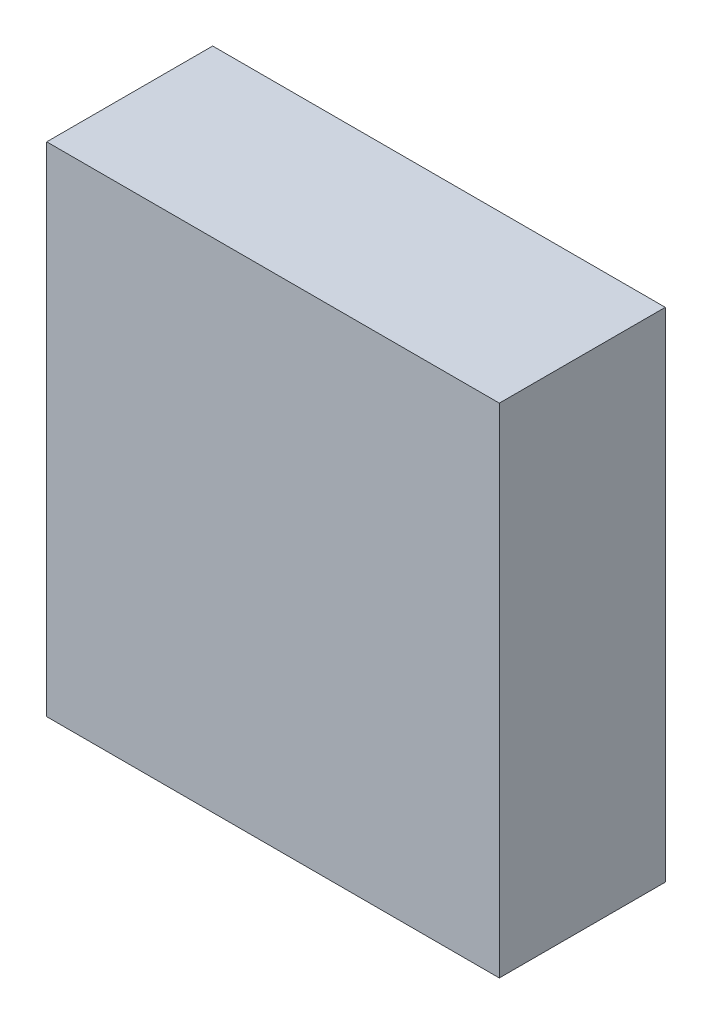
ISO-10303-21;
HEADER;
FILE_DESCRIPTION(('STEP AP214'),'2;1');
FILE_NAME('part.step','',(''),(''),'','','');
FILE_SCHEMA(('AUTOMOTIVE_DESIGN { 1 0 10303 214 1 1 1 1 }'));
ENDSEC;
DATA;
#1=APPLICATION_CONTEXT('core data for automotive mechanical design processes');
#2=APPLICATION_PROTOCOL_DEFINITION('international standard','automotive_design',2000,#1);
#3=PRODUCT_CONTEXT('',#1,'mechanical');
#4=PRODUCT('Part','Part','',(#3));
#5=PRODUCT_RELATED_PRODUCT_CATEGORY('part','',(#4));
#6=PRODUCT_DEFINITION_FORMATION('','',#4);
#7=PRODUCT_DEFINITION_CONTEXT('part definition',#1,'design');
#8=PRODUCT_DEFINITION('design','',#6,#7);
#9=PRODUCT_DEFINITION_SHAPE('','',#8);
#10=(LENGTH_UNIT() NAMED_UNIT(*) SI_UNIT(.MILLI.,.METRE.));
#11=(NAMED_UNIT(*) PLANE_ANGLE_UNIT() SI_UNIT($,.RADIAN.));
#12=(NAMED_UNIT(*) SI_UNIT($,.STERADIAN.) SOLID_ANGLE_UNIT());
#13=UNCERTAINTY_MEASURE_WITH_UNIT(LENGTH_MEASURE(1.E-05),#10,'distance_accuracy_value','');
#14=(GEOMETRIC_REPRESENTATION_CONTEXT(3) GLOBAL_UNCERTAINTY_ASSIGNED_CONTEXT((#13)) GLOBAL_UNIT_ASSIGNED_CONTEXT((#10,
#11,#12)) REPRESENTATION_CONTEXT('',''));
#15=CARTESIAN_POINT('',(0.,0.,0.));
#16=DIRECTION('',(0.,0.,1.));
#17=DIRECTION('',(1.,0.,0.));
#18=AXIS2_PLACEMENT_3D('',#15,#16,#17);
#19=CARTESIAN_POINT('',(45.,-176.,206.5));
#20=DIRECTION('',(0.,0.,1.));
#21=DIRECTION('',(1.,0.,0.));
#22=AXIS2_PLACEMENT_3D('',#19,#20,#21);
#23=PLANE('',#22);
#24=DIRECTION('',(0.,1.,0.));
#25=VECTOR('',#24,1.);
#26=CARTESIAN_POINT('',(45.,-176.,206.5));
#27=LINE('',#26,#25);
#28=CARTESIAN_POINT('',(45.,-176.,206.5));
#29=VERTEX_POINT('',#28);
#30=CARTESIAN_POINT('',(45.,-110.,206.5));
#31=VERTEX_POINT('',#30);
#32=EDGE_CURVE('E18',#29,#31,#27,.T.);
#33=ORIENTED_EDGE('',*,*,#32,.F.);
#34=DIRECTION('',(1.,0.,0.));
#35=VECTOR('',#34,1.);
#36=CARTESIAN_POINT('',(45.,-176.,206.5));
#37=LINE('',#36,#35);
#38=CARTESIAN_POINT('',(105.,-176.,206.5));
#39=VERTEX_POINT('',#38);
#40=EDGE_CURVE('E49',#29,#39,#37,.T.);
#41=ORIENTED_EDGE('',*,*,#40,.T.);
#42=DIRECTION('',(0.,1.,0.));
#43=VECTOR('',#42,1.);
#44=CARTESIAN_POINT('',(105.,-176.,206.5));
#45=LINE('',#44,#43);
#46=CARTESIAN_POINT('',(105.,-110.,206.5));
#47=VERTEX_POINT('',#46);
#48=EDGE_CURVE('E83',#39,#47,#45,.T.);
#49=ORIENTED_EDGE('',*,*,#48,.T.);
#50=DIRECTION('',(1.,0.,0.));
#51=VECTOR('',#50,1.);
#52=CARTESIAN_POINT('',(45.,-110.,206.5));
#53=LINE('',#52,#51);
#54=EDGE_CURVE('E9',#31,#47,#53,.T.);
#55=ORIENTED_EDGE('',*,*,#54,.F.);
#56=EDGE_LOOP('',(#33,#41,#49,#55));
#57=FACE_BOUND('',#56,.T.);
#58=ADVANCED_FACE('F14',(#57),#23,.T.);
#59=CARTESIAN_POINT('',(45.,-176.,184.5));
#60=DIRECTION('',(0.,0.,1.));
#61=DIRECTION('',(1.,0.,0.));
#62=AXIS2_PLACEMENT_3D('',#59,#60,#61);
#63=PLANE('',#62);
#64=DIRECTION('',(1.,0.,0.));
#65=VECTOR('',#64,1.);
#66=CARTESIAN_POINT('',(45.,-110.,184.5));
#67=LINE('',#66,#65);
#68=CARTESIAN_POINT('',(45.,-110.,184.5));
#69=VERTEX_POINT('',#68);
#70=CARTESIAN_POINT('',(105.,-110.,184.5));
#71=VERTEX_POINT('',#70);
#72=EDGE_CURVE('E25',#69,#71,#67,.T.);
#73=ORIENTED_EDGE('',*,*,#72,.T.);
#74=DIRECTION('',(0.,1.,0.));
#75=VECTOR('',#74,1.);
#76=CARTESIAN_POINT('',(105.,-176.,184.5));
#77=LINE('',#76,#75);
#78=CARTESIAN_POINT('',(105.,-176.,184.5));
#79=VERTEX_POINT('',#78);
#80=EDGE_CURVE('E104',#79,#71,#77,.T.);
#81=ORIENTED_EDGE('',*,*,#80,.F.);
#82=DIRECTION('',(1.,0.,0.));
#83=VECTOR('',#82,1.);
#84=CARTESIAN_POINT('',(45.,-176.,184.5));
#85=LINE('',#84,#83);
#86=CARTESIAN_POINT('',(45.,-176.,184.5));
#87=VERTEX_POINT('',#86);
#88=EDGE_CURVE('E59',#87,#79,#85,.T.);
#89=ORIENTED_EDGE('',*,*,#88,.F.);
#90=DIRECTION('',(0.,1.,0.));
#91=VECTOR('',#90,1.);
#92=CARTESIAN_POINT('',(45.,-176.,184.5));
#93=LINE('',#92,#91);
#94=EDGE_CURVE('E89',#87,#69,#93,.T.);
#95=ORIENTED_EDGE('',*,*,#94,.T.);
#96=EDGE_LOOP('',(#73,#81,#89,#95));
#97=FACE_BOUND('',#96,.T.);
#98=ADVANCED_FACE('F121',(#97),#63,.F.);
#99=CARTESIAN_POINT('',(45.,-110.,184.5));
#100=DIRECTION('',(0.,1.,0.));
#101=DIRECTION('',(1.,0.,0.));
#102=AXIS2_PLACEMENT_3D('',#99,#100,#101);
#103=PLANE('',#102);
#104=ORIENTED_EDGE('',*,*,#72,.F.);
#105=DIRECTION('',(0.,0.,1.));
#106=VECTOR('',#105,1.);
#107=CARTESIAN_POINT('',(45.,-110.,184.5));
#108=LINE('',#107,#106);
#109=EDGE_CURVE('E93',#69,#31,#108,.T.);
#110=ORIENTED_EDGE('',*,*,#109,.T.);
#111=ORIENTED_EDGE('',*,*,#54,.T.);
#112=DIRECTION('',(0.,0.,1.));
#113=VECTOR('',#112,1.);
#114=CARTESIAN_POINT('',(105.,-110.,184.5));
#115=LINE('',#114,#113);
#116=EDGE_CURVE('E113',#71,#47,#115,.T.);
#117=ORIENTED_EDGE('',*,*,#116,.F.);
#118=EDGE_LOOP('',(#104,#110,#111,#117));
#119=FACE_BOUND('',#118,.T.);
#120=ADVANCED_FACE('F120',(#119),#103,.T.);
#121=CARTESIAN_POINT('',(45.,-176.,184.5));
#122=DIRECTION('',(0.,1.,0.));
#123=DIRECTION('',(1.,0.,0.));
#124=AXIS2_PLACEMENT_3D('',#121,#122,#123);
#125=PLANE('',#124);
#126=DIRECTION('',(0.,0.,1.));
#127=VECTOR('',#126,1.);
#128=CARTESIAN_POINT('',(105.,-176.,184.5));
#129=LINE('',#128,#127);
#130=EDGE_CURVE('E81',#79,#39,#129,.T.);
#131=ORIENTED_EDGE('',*,*,#130,.T.);
#132=ORIENTED_EDGE('',*,*,#40,.F.);
#133=DIRECTION('',(0.,0.,1.));
#134=VECTOR('',#133,1.);
#135=CARTESIAN_POINT('',(45.,-176.,184.5));
#136=LINE('',#135,#134);
#137=EDGE_CURVE('E78',#87,#29,#136,.T.);
#138=ORIENTED_EDGE('',*,*,#137,.F.);
#139=ORIENTED_EDGE('',*,*,#88,.T.);
#140=EDGE_LOOP('',(#131,#132,#138,#139));
#141=FACE_BOUND('',#140,.T.);
#142=ADVANCED_FACE('F77',(#141),#125,.F.);
#143=CARTESIAN_POINT('',(105.,-176.,184.5));
#144=DIRECTION('',(1.,0.,0.));
#145=DIRECTION('',(0.,1.,0.));
#146=AXIS2_PLACEMENT_3D('',#143,#144,#145);
#147=PLANE('',#146);
#148=ORIENTED_EDGE('',*,*,#130,.F.);
#149=ORIENTED_EDGE('',*,*,#80,.T.);
#150=ORIENTED_EDGE('',*,*,#116,.T.);
#151=ORIENTED_EDGE('',*,*,#48,.F.);
#152=EDGE_LOOP('',(#148,#149,#150,#151));
#153=FACE_BOUND('',#152,.T.);
#154=ADVANCED_FACE('F16',(#153),#147,.T.);
#155=CARTESIAN_POINT('',(45.,-176.,184.5));
#156=DIRECTION('',(1.,0.,0.));
#157=DIRECTION('',(0.,1.,0.));
#158=AXIS2_PLACEMENT_3D('',#155,#156,#157);
#159=PLANE('',#158);
#160=ORIENTED_EDGE('',*,*,#32,.T.);
#161=ORIENTED_EDGE('',*,*,#109,.F.);
#162=ORIENTED_EDGE('',*,*,#94,.F.);
#163=ORIENTED_EDGE('',*,*,#137,.T.);
#164=EDGE_LOOP('',(#160,#161,#162,#163));
#165=FACE_BOUND('',#164,.T.);
#166=ADVANCED_FACE('F87',(#165),#159,.F.);
#167=CLOSED_SHELL('',(#58,#98,#120,#142,#154,#166));
#168=MANIFOLD_SOLID_BREP('B1',#167);
#169=ADVANCED_BREP_SHAPE_REPRESENTATION('',(#18,#168),#14);
#170=SHAPE_DEFINITION_REPRESENTATION(#9,#169);
ENDSEC;
END-ISO-10303-21;
